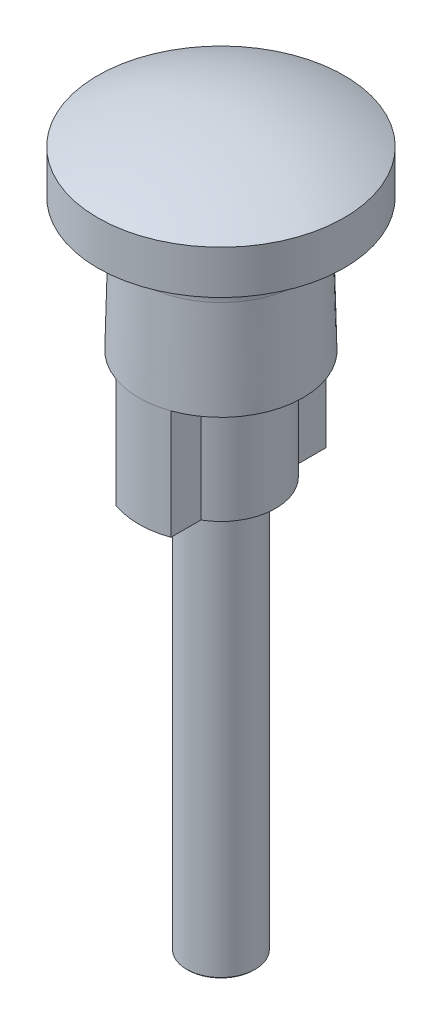
ISO-10303-21;
HEADER;
FILE_DESCRIPTION(('STEP AP214'),'2;1');
FILE_NAME('part.step','',(''),(''),'','','');
FILE_SCHEMA(('AUTOMOTIVE_DESIGN { 1 0 10303 214 1 1 1 1 }'));
ENDSEC;
DATA;
#1=APPLICATION_CONTEXT('core data for automotive mechanical design processes');
#2=APPLICATION_PROTOCOL_DEFINITION('international standard','automotive_design',2000,#1);
#3=PRODUCT_CONTEXT('',#1,'mechanical');
#4=PRODUCT('Part','Part','',(#3));
#5=PRODUCT_RELATED_PRODUCT_CATEGORY('part','',(#4));
#6=PRODUCT_DEFINITION_FORMATION('','',#4);
#7=PRODUCT_DEFINITION_CONTEXT('part definition',#1,'design');
#8=PRODUCT_DEFINITION('design','',#6,#7);
#9=PRODUCT_DEFINITION_SHAPE('','',#8);
#10=(LENGTH_UNIT() NAMED_UNIT(*) SI_UNIT(.MILLI.,.METRE.));
#11=(NAMED_UNIT(*) PLANE_ANGLE_UNIT() SI_UNIT($,.RADIAN.));
#12=(NAMED_UNIT(*) SI_UNIT($,.STERADIAN.) SOLID_ANGLE_UNIT());
#13=UNCERTAINTY_MEASURE_WITH_UNIT(LENGTH_MEASURE(1.E-05),#10,'distance_accuracy_value','');
#14=(GEOMETRIC_REPRESENTATION_CONTEXT(3) GLOBAL_UNCERTAINTY_ASSIGNED_CONTEXT((#13)) GLOBAL_UNIT_ASSIGNED_CONTEXT((#10,
#11,#12)) REPRESENTATION_CONTEXT('',''));
#15=CARTESIAN_POINT('',(0.,0.,0.));
#16=DIRECTION('',(0.,0.,1.));
#17=DIRECTION('',(1.,0.,0.));
#18=AXIS2_PLACEMENT_3D('',#15,#16,#17);
#19=CARTESIAN_POINT('',(0.,24.8362264150944,0.));
#20=DIRECTION('',(1.,0.,0.));
#21=DIRECTION('',(0.,0.,1.));
#22=AXIS2_PLACEMENT_3D('',#19,#20,#21);
#23=SPHERICAL_SURFACE('',#22,20.1637735849056);
#24=CARTESIAN_POINT('',(0.,42.88,0.));
#25=DIRECTION('',(0.,1.,0.));
#26=DIRECTION('',(0.,0.,1.));
#27=AXIS2_PLACEMENT_3D('',#24,#25,#26);
#28=CIRCLE('',#27,9.);
#29=CARTESIAN_POINT('',(0.,42.88,9.));
#30=VERTEX_POINT('',#29);
#31=EDGE_CURVE('E204',#30,#30,#28,.F.);
#32=ORIENTED_EDGE('',*,*,#31,.F.);
#33=EDGE_LOOP('',(#32));
#34=FACE_BOUND('',#33,.T.);
#35=ADVANCED_FACE('F16',(#34),#23,.T.);
#36=CARTESIAN_POINT('',(0.,-8.,0.));
#37=DIRECTION('',(0.,1.,0.));
#38=DIRECTION('',(0.,0.,1.));
#39=AXIS2_PLACEMENT_3D('',#36,#37,#38);
#40=CYLINDRICAL_SURFACE('',#39,9.);
#41=ORIENTED_EDGE('',*,*,#31,.T.);
#42=EDGE_LOOP('',(#41));
#43=FACE_BOUND('',#42,.T.);
#44=CARTESIAN_POINT('',(0.,39.7,0.));
#45=DIRECTION('',(0.,1.,0.));
#46=DIRECTION('',(0.,0.,1.));
#47=AXIS2_PLACEMENT_3D('',#44,#45,#46);
#48=CIRCLE('',#47,9.);
#49=CARTESIAN_POINT('',(0.,39.7,9.));
#50=VERTEX_POINT('',#49);
#51=EDGE_CURVE('E199',#50,#50,#48,.T.);
#52=ORIENTED_EDGE('',*,*,#51,.T.);
#53=EDGE_LOOP('',(#52));
#54=FACE_BOUND('',#53,.T.);
#55=ADVANCED_FACE('F234',(#43,#54),#40,.T.);
#56=CARTESIAN_POINT('',(9.,39.7,0.));
#57=DIRECTION('',(0.,1.,0.));
#58=DIRECTION('',(0.,0.,1.));
#59=AXIS2_PLACEMENT_3D('',#56,#57,#58);
#60=PLANE('',#59);
#61=CARTESIAN_POINT('',(0.,39.7,0.));
#62=DIRECTION('',(0.,-1.,0.));
#63=DIRECTION('',(0.,0.,-1.));
#64=AXIS2_PLACEMENT_3D('',#61,#62,#63);
#65=CIRCLE('',#64,8.32478228857056);
#66=CARTESIAN_POINT('',(0.,39.7,8.32478228857056));
#67=VERTEX_POINT('',#66);
#68=CARTESIAN_POINT('',(0.,39.7,-8.32478228857056));
#69=VERTEX_POINT('',#68);
#70=EDGE_CURVE('E203',#67,#69,#65,.F.);
#71=ORIENTED_EDGE('',*,*,#70,.T.);
#72=CARTESIAN_POINT('',(0.,39.7,0.));
#73=DIRECTION('',(0.,-1.,0.));
#74=DIRECTION('',(0.,0.,1.));
#75=AXIS2_PLACEMENT_3D('',#72,#73,#74);
#76=CIRCLE('',#75,8.32478228857056);
#77=EDGE_CURVE('E109',#69,#67,#76,.F.);
#78=ORIENTED_EDGE('',*,*,#77,.T.);
#79=EDGE_LOOP('',(#71,#78));
#80=FACE_BOUND('',#79,.T.);
#81=ORIENTED_EDGE('',*,*,#51,.F.);
#82=EDGE_LOOP('',(#81));
#83=FACE_BOUND('',#82,.T.);
#84=ADVANCED_FACE('F154',(#80,#83),#60,.F.);
#85=CARTESIAN_POINT('',(0.,37.2,0.));
#86=DIRECTION('',(0.,-1.,0.));
#87=DIRECTION('',(0.,0.,-1.));
#88=AXIS2_PLACEMENT_3D('',#85,#86,#87);
#89=TOROIDAL_SURFACE('',#88,8.32478228857056,2.5);
#90=ORIENTED_EDGE('',*,*,#77,.F.);
#91=ORIENTED_EDGE('',*,*,#70,.F.);
#92=EDGE_LOOP('',(#90,#91));
#93=FACE_BOUND('',#92,.T.);
#94=CARTESIAN_POINT('',(0.,37.138919554593,0.));
#95=DIRECTION('',(0.,-1.,0.));
#96=DIRECTION('',(0.,0.,-1.));
#97=AXIS2_PLACEMENT_3D('',#94,#95,#96);
#98=CIRCLE('',#97,5.82552856411844);
#99=CARTESIAN_POINT('',(0.,37.138919554593,-5.82552856411844));
#100=VERTEX_POINT('',#99);
#101=EDGE_CURVE('E108',#100,#100,#98,.T.);
#102=ORIENTED_EDGE('',*,*,#101,.F.);
#103=EDGE_LOOP('',(#102));
#104=FACE_BOUND('',#103,.T.);
#105=ADVANCED_FACE('F149',(#93,#104),#89,.F.);
#106=CARTESIAN_POINT('',(0.,30.,0.));
#107=DIRECTION('',(0.,1.,0.));
#108=DIRECTION('',(0.,0.,1.));
#109=AXIS2_PLACEMENT_3D('',#106,#107,#108);
#110=PLANE('',#109);
#111=CARTESIAN_POINT('',(0.,30.,0.));
#112=DIRECTION('',(0.,1.,0.));
#113=DIRECTION('',(0.,0.,1.));
#114=AXIS2_PLACEMENT_3D('',#111,#112,#113);
#115=CIRCLE('',#114,4.);
#116=CARTESIAN_POINT('',(-2.,30.,3.46410161513776));
#117=VERTEX_POINT('',#116);
#118=CARTESIAN_POINT('',(-2.,30.,-3.46410161513776));
#119=VERTEX_POINT('',#118);
#120=EDGE_CURVE('E119',#117,#119,#115,.F.);
#121=ORIENTED_EDGE('',*,*,#120,.F.);
#122=DIRECTION('',(0.,0.,1.));
#123=VECTOR('',#122,1.);
#124=CARTESIAN_POINT('',(-2.,30.,5.65685424949238));
#125=LINE('',#124,#123);
#126=CARTESIAN_POINT('',(-2.,29.9999999999864,5.65685424949283));
#127=VERTEX_POINT('',#126);
#128=EDGE_CURVE('E106',#127,#117,#125,.F.);
#129=ORIENTED_EDGE('',*,*,#128,.F.);
#130=CARTESIAN_POINT('',(0.,29.9999999999727,0.));
#131=DIRECTION('',(0.,-1.,0.));
#132=DIRECTION('',(0.,0.,-1.));
#133=AXIS2_PLACEMENT_3D('',#130,#131,#132);
#134=CIRCLE('',#133,6.00000000000084);
#135=CARTESIAN_POINT('',(-2.,29.9999999999864,-5.65685424949283));
#136=VERTEX_POINT('',#135);
#137=EDGE_CURVE('E88',#136,#127,#134,.F.);
#138=ORIENTED_EDGE('',*,*,#137,.F.);
#139=DIRECTION('',(0.,0.,1.));
#140=VECTOR('',#139,1.);
#141=CARTESIAN_POINT('',(-2.,30.,-3.46410161513775));
#142=LINE('',#141,#140);
#143=EDGE_CURVE('E97',#119,#136,#142,.F.);
#144=ORIENTED_EDGE('',*,*,#143,.F.);
#145=EDGE_LOOP('',(#121,#129,#138,#144));
#146=FACE_BOUND('',#145,.T.);
#147=ADVANCED_FACE('F102',(#146),#110,.F.);
#148=CARTESIAN_POINT('',(0.,30.0000000001432,0.));
#149=DIRECTION('',(0.,-1.,0.));
#150=DIRECTION('',(0.,0.,-1.));
#151=AXIS2_PLACEMENT_3D('',#148,#149,#150);
#152=CONICAL_SURFACE('',#151,5.99999999999667,0.0244346095278823);
#153=ORIENTED_EDGE('',*,*,#101,.T.);
#154=EDGE_LOOP('',(#153));
#155=FACE_BOUND('',#154,.T.);
#156=CARTESIAN_POINT('',(0.,29.9999999999999,0.));
#157=DIRECTION('',(0.,1.,0.));
#158=DIRECTION('',(0.,0.,1.));
#159=AXIS2_PLACEMENT_3D('',#156,#157,#158);
#160=CIRCLE('',#159,6.);
#161=CARTESIAN_POINT('',(2.,29.9999999999864,5.65685424949283));
#162=VERTEX_POINT('',#161);
#163=EDGE_CURVE('E457',#162,#127,#160,.F.);
#164=ORIENTED_EDGE('',*,*,#163,.F.);
#165=CARTESIAN_POINT('',(0.,29.9999999999727,0.));
#166=DIRECTION('',(0.,-1.,0.));
#167=DIRECTION('',(0.,0.,-1.));
#168=AXIS2_PLACEMENT_3D('',#165,#166,#167);
#169=CIRCLE('',#168,6.00000000000084);
#170=CARTESIAN_POINT('',(2.,29.9999999999864,-5.65685424949283));
#171=VERTEX_POINT('',#170);
#172=EDGE_CURVE('E91',#162,#171,#169,.F.);
#173=ORIENTED_EDGE('',*,*,#172,.T.);
#174=CARTESIAN_POINT('',(0.,29.9999999999999,0.));
#175=DIRECTION('',(0.,1.,0.));
#176=DIRECTION('',(0.,0.,1.));
#177=AXIS2_PLACEMENT_3D('',#174,#175,#176);
#178=CIRCLE('',#177,6.);
#179=EDGE_CURVE('E85',#136,#171,#178,.F.);
#180=ORIENTED_EDGE('',*,*,#179,.F.);
#181=ORIENTED_EDGE('',*,*,#137,.T.);
#182=EDGE_LOOP('',(#164,#173,#180,#181));
#183=FACE_BOUND('',#182,.T.);
#184=ADVANCED_FACE('F87',(#155,#183),#152,.T.);
#185=CARTESIAN_POINT('',(0.,30.,0.));
#186=DIRECTION('',(0.,1.,0.));
#187=DIRECTION('',(0.,0.,1.));
#188=AXIS2_PLACEMENT_3D('',#185,#186,#187);
#189=PLANE('',#188);
#190=CARTESIAN_POINT('',(0.,30.,0.));
#191=DIRECTION('',(0.,1.,0.));
#192=DIRECTION('',(0.,0.,1.));
#193=AXIS2_PLACEMENT_3D('',#190,#191,#192);
#194=CIRCLE('',#193,4.);
#195=CARTESIAN_POINT('',(2.,30.,-3.46410161513775));
#196=VERTEX_POINT('',#195);
#197=CARTESIAN_POINT('',(2.,30.,3.46410161513775));
#198=VERTEX_POINT('',#197);
#199=EDGE_CURVE('E141',#196,#198,#194,.F.);
#200=ORIENTED_EDGE('',*,*,#199,.F.);
#201=DIRECTION('',(0.,0.,-1.));
#202=VECTOR('',#201,1.);
#203=CARTESIAN_POINT('',(2.,30.,-5.65685424949238));
#204=LINE('',#203,#202);
#205=EDGE_CURVE('E136',#171,#196,#204,.F.);
#206=ORIENTED_EDGE('',*,*,#205,.F.);
#207=ORIENTED_EDGE('',*,*,#172,.F.);
#208=DIRECTION('',(0.,0.,-1.));
#209=VECTOR('',#208,1.);
#210=CARTESIAN_POINT('',(2.,30.,3.46410161513775));
#211=LINE('',#210,#209);
#212=EDGE_CURVE('E441',#198,#162,#211,.F.);
#213=ORIENTED_EDGE('',*,*,#212,.F.);
#214=EDGE_LOOP('',(#200,#206,#207,#213));
#215=FACE_BOUND('',#214,.T.);
#216=ADVANCED_FACE('F288',(#215),#189,.F.);
#217=CARTESIAN_POINT('',(0.,30.,0.));
#218=DIRECTION('',(0.,1.,0.));
#219=DIRECTION('',(0.,0.,1.));
#220=AXIS2_PLACEMENT_3D('',#217,#218,#219);
#221=CYLINDRICAL_SURFACE('',#220,4.);
#222=DIRECTION('',(0.,1.,0.));
#223=VECTOR('',#222,1.);
#224=CARTESIAN_POINT('',(2.,30.,-3.46410161513775));
#225=LINE('',#224,#223);
#226=CARTESIAN_POINT('',(2.,22.,-3.46410161513775));
#227=VERTEX_POINT('',#226);
#228=EDGE_CURVE('E140',#196,#227,#225,.F.);
#229=ORIENTED_EDGE('',*,*,#228,.F.);
#230=ORIENTED_EDGE('',*,*,#199,.T.);
#231=DIRECTION('',(0.,1.,0.));
#232=VECTOR('',#231,1.);
#233=CARTESIAN_POINT('',(2.,30.,3.46410161513775));
#234=LINE('',#233,#232);
#235=CARTESIAN_POINT('',(2.,22.,3.46410161513775));
#236=VERTEX_POINT('',#235);
#237=EDGE_CURVE('E454',#236,#198,#234,.T.);
#238=ORIENTED_EDGE('',*,*,#237,.F.);
#239=CARTESIAN_POINT('',(0.,22.,0.));
#240=DIRECTION('',(0.,1.,0.));
#241=DIRECTION('',(0.,0.,1.));
#242=AXIS2_PLACEMENT_3D('',#239,#240,#241);
#243=CIRCLE('',#242,4.);
#244=EDGE_CURVE('E190',#236,#227,#243,.T.);
#245=ORIENTED_EDGE('',*,*,#244,.T.);
#246=EDGE_LOOP('',(#229,#230,#238,#245));
#247=FACE_BOUND('',#246,.T.);
#248=ADVANCED_FACE('F284',(#247),#221,.T.);
#249=CARTESIAN_POINT('',(2.,30.,-5.65685424949238));
#250=DIRECTION('',(1.,0.,0.));
#251=DIRECTION('',(0.,0.,-1.));
#252=AXIS2_PLACEMENT_3D('',#249,#250,#251);
#253=PLANE('',#252);
#254=ORIENTED_EDGE('',*,*,#205,.T.);
#255=ORIENTED_EDGE('',*,*,#228,.T.);
#256=DIRECTION('',(0.,0.,1.));
#257=VECTOR('',#256,1.);
#258=CARTESIAN_POINT('',(2.,22.,0.));
#259=LINE('',#258,#257);
#260=CARTESIAN_POINT('',(2.,22.,-5.65685424949238));
#261=VERTEX_POINT('',#260);
#262=EDGE_CURVE('E189',#227,#261,#259,.F.);
#263=ORIENTED_EDGE('',*,*,#262,.T.);
#264=DIRECTION('',(0.,1.,0.));
#265=VECTOR('',#264,1.);
#266=CARTESIAN_POINT('',(2.,-8.,-5.65685424949238));
#267=LINE('',#266,#265);
#268=EDGE_CURVE('E98',#171,#261,#267,.F.);
#269=ORIENTED_EDGE('',*,*,#268,.F.);
#270=EDGE_LOOP('',(#254,#255,#263,#269));
#271=FACE_BOUND('',#270,.T.);
#272=ADVANCED_FACE('F281',(#271),#253,.T.);
#273=CARTESIAN_POINT('',(0.,-8.,0.));
#274=DIRECTION('',(0.,1.,0.));
#275=DIRECTION('',(0.,0.,1.));
#276=AXIS2_PLACEMENT_3D('',#273,#274,#275);
#277=CYLINDRICAL_SURFACE('',#276,6.);
#278=DIRECTION('',(0.,1.,0.));
#279=VECTOR('',#278,1.);
#280=CARTESIAN_POINT('',(-2.,30.,-5.65685424949238));
#281=LINE('',#280,#279);
#282=CARTESIAN_POINT('',(-2.,22.,-5.65685424949238));
#283=VERTEX_POINT('',#282);
#284=EDGE_CURVE('E112',#136,#283,#281,.F.);
#285=ORIENTED_EDGE('',*,*,#284,.F.);
#286=ORIENTED_EDGE('',*,*,#179,.T.);
#287=ORIENTED_EDGE('',*,*,#268,.T.);
#288=CARTESIAN_POINT('',(0.,22.,0.));
#289=DIRECTION('',(0.,1.,0.));
#290=DIRECTION('',(0.,0.,1.));
#291=AXIS2_PLACEMENT_3D('',#288,#289,#290);
#292=CIRCLE('',#291,6.);
#293=EDGE_CURVE('E115',#261,#283,#292,.T.);
#294=ORIENTED_EDGE('',*,*,#293,.T.);
#295=EDGE_LOOP('',(#285,#286,#287,#294));
#296=FACE_BOUND('',#295,.T.);
#297=ADVANCED_FACE('F113',(#296),#277,.T.);
#298=CARTESIAN_POINT('',(-2.,30.,-3.46410161513775));
#299=DIRECTION('',(-1.,0.,0.));
#300=DIRECTION('',(0.,0.,1.));
#301=AXIS2_PLACEMENT_3D('',#298,#299,#300);
#302=PLANE('',#301);
#303=ORIENTED_EDGE('',*,*,#143,.T.);
#304=ORIENTED_EDGE('',*,*,#284,.T.);
#305=DIRECTION('',(0.,0.,1.));
#306=VECTOR('',#305,1.);
#307=CARTESIAN_POINT('',(-2.,22.,0.));
#308=LINE('',#307,#306);
#309=CARTESIAN_POINT('',(-2.,22.,-3.46410161513776));
#310=VERTEX_POINT('',#309);
#311=EDGE_CURVE('E186',#283,#310,#308,.T.);
#312=ORIENTED_EDGE('',*,*,#311,.T.);
#313=DIRECTION('',(0.,1.,0.));
#314=VECTOR('',#313,1.);
#315=CARTESIAN_POINT('',(-2.,30.,-3.46410161513776));
#316=LINE('',#315,#314);
#317=EDGE_CURVE('E123',#119,#310,#316,.F.);
#318=ORIENTED_EDGE('',*,*,#317,.F.);
#319=EDGE_LOOP('',(#303,#304,#312,#318));
#320=FACE_BOUND('',#319,.T.);
#321=ADVANCED_FACE('F121',(#320),#302,.T.);
#322=CARTESIAN_POINT('',(0.,30.,0.));
#323=DIRECTION('',(0.,1.,0.));
#324=DIRECTION('',(0.,0.,1.));
#325=AXIS2_PLACEMENT_3D('',#322,#323,#324);
#326=CYLINDRICAL_SURFACE('',#325,4.);
#327=ORIENTED_EDGE('',*,*,#120,.T.);
#328=ORIENTED_EDGE('',*,*,#317,.T.);
#329=CARTESIAN_POINT('',(0.,22.,0.));
#330=DIRECTION('',(0.,1.,0.));
#331=DIRECTION('',(0.,0.,1.));
#332=AXIS2_PLACEMENT_3D('',#329,#330,#331);
#333=CIRCLE('',#332,4.);
#334=CARTESIAN_POINT('',(-2.,22.,3.46410161513776));
#335=VERTEX_POINT('',#334);
#336=EDGE_CURVE('E183',#310,#335,#333,.T.);
#337=ORIENTED_EDGE('',*,*,#336,.T.);
#338=DIRECTION('',(0.,1.,0.));
#339=VECTOR('',#338,1.);
#340=CARTESIAN_POINT('',(-2.,30.,3.46410161513776));
#341=LINE('',#340,#339);
#342=EDGE_CURVE('E456',#117,#335,#341,.F.);
#343=ORIENTED_EDGE('',*,*,#342,.F.);
#344=EDGE_LOOP('',(#327,#328,#337,#343));
#345=FACE_BOUND('',#344,.T.);
#346=ADVANCED_FACE('F272',(#345),#326,.T.);
#347=CARTESIAN_POINT('',(-2.,30.,5.65685424949238));
#348=DIRECTION('',(-1.,0.,0.));
#349=DIRECTION('',(0.,0.,1.));
#350=AXIS2_PLACEMENT_3D('',#347,#348,#349);
#351=PLANE('',#350);
#352=ORIENTED_EDGE('',*,*,#128,.T.);
#353=ORIENTED_EDGE('',*,*,#342,.T.);
#354=DIRECTION('',(0.,0.,1.));
#355=VECTOR('',#354,1.);
#356=CARTESIAN_POINT('',(-2.,22.,0.));
#357=LINE('',#356,#355);
#358=CARTESIAN_POINT('',(-2.,22.,5.65685424949238));
#359=VERTEX_POINT('',#358);
#360=EDGE_CURVE('E182',#335,#359,#357,.T.);
#361=ORIENTED_EDGE('',*,*,#360,.T.);
#362=DIRECTION('',(0.,1.,0.));
#363=VECTOR('',#362,1.);
#364=CARTESIAN_POINT('',(-2.,-8.,5.65685424949238));
#365=LINE('',#364,#363);
#366=EDGE_CURVE('E459',#127,#359,#365,.F.);
#367=ORIENTED_EDGE('',*,*,#366,.F.);
#368=EDGE_LOOP('',(#352,#353,#361,#367));
#369=FACE_BOUND('',#368,.T.);
#370=ADVANCED_FACE('F269',(#369),#351,.T.);
#371=CARTESIAN_POINT('',(0.,-8.,0.));
#372=DIRECTION('',(0.,1.,0.));
#373=DIRECTION('',(0.,0.,1.));
#374=AXIS2_PLACEMENT_3D('',#371,#372,#373);
#375=CYLINDRICAL_SURFACE('',#374,6.);
#376=ORIENTED_EDGE('',*,*,#366,.T.);
#377=CARTESIAN_POINT('',(0.,22.,0.));
#378=DIRECTION('',(0.,1.,0.));
#379=DIRECTION('',(0.,0.,1.));
#380=AXIS2_PLACEMENT_3D('',#377,#378,#379);
#381=CIRCLE('',#380,6.);
#382=CARTESIAN_POINT('',(2.,22.,5.65685424949238));
#383=VERTEX_POINT('',#382);
#384=EDGE_CURVE('E38',#359,#383,#381,.T.);
#385=ORIENTED_EDGE('',*,*,#384,.T.);
#386=DIRECTION('',(0.,1.,0.));
#387=VECTOR('',#386,1.);
#388=CARTESIAN_POINT('',(2.,30.,5.65685424949238));
#389=LINE('',#388,#387);
#390=EDGE_CURVE('E192',#162,#383,#389,.F.);
#391=ORIENTED_EDGE('',*,*,#390,.F.);
#392=ORIENTED_EDGE('',*,*,#163,.T.);
#393=EDGE_LOOP('',(#376,#385,#391,#392));
#394=FACE_BOUND('',#393,.T.);
#395=ADVANCED_FACE('F265',(#394),#375,.T.);
#396=CARTESIAN_POINT('',(2.,30.,3.46410161513775));
#397=DIRECTION('',(1.,0.,0.));
#398=DIRECTION('',(0.,0.,-1.));
#399=AXIS2_PLACEMENT_3D('',#396,#397,#398);
#400=PLANE('',#399);
#401=ORIENTED_EDGE('',*,*,#212,.T.);
#402=ORIENTED_EDGE('',*,*,#390,.T.);
#403=DIRECTION('',(0.,0.,1.));
#404=VECTOR('',#403,1.);
#405=CARTESIAN_POINT('',(2.,22.,0.));
#406=LINE('',#405,#404);
#407=EDGE_CURVE('E179',#383,#236,#406,.F.);
#408=ORIENTED_EDGE('',*,*,#407,.T.);
#409=ORIENTED_EDGE('',*,*,#237,.T.);
#410=EDGE_LOOP('',(#401,#402,#408,#409));
#411=FACE_BOUND('',#410,.T.);
#412=ADVANCED_FACE('F261',(#411),#400,.T.);
#413=CARTESIAN_POINT('',(2.4,-8.,0.));
#414=DIRECTION('',(0.,1.,0.));
#415=DIRECTION('',(0.,0.,1.));
#416=AXIS2_PLACEMENT_3D('',#413,#414,#415);
#417=PLANE('',#416);
#418=CARTESIAN_POINT('',(0.,-7.99999999998136,0.));
#419=DIRECTION('',(0.,1.,0.));
#420=DIRECTION('',(0.,0.,1.));
#421=AXIS2_PLACEMENT_3D('',#418,#419,#420);
#422=CIRCLE('',#421,2.40000000002283);
#423=CARTESIAN_POINT('',(0.,-7.99999999998136,2.40000000002283));
#424=VERTEX_POINT('',#423);
#425=EDGE_CURVE('E175',#424,#424,#422,.T.);
#426=ORIENTED_EDGE('',*,*,#425,.F.);
#427=EDGE_LOOP('',(#426));
#428=FACE_BOUND('',#427,.T.);
#429=ADVANCED_FACE('F257',(#428),#417,.F.);
#430=CARTESIAN_POINT('',(6.,22.,0.));
#431=DIRECTION('',(0.,1.,0.));
#432=DIRECTION('',(0.,0.,1.));
#433=AXIS2_PLACEMENT_3D('',#430,#431,#432);
#434=PLANE('',#433);
#435=CARTESIAN_POINT('',(0.,22.,0.));
#436=DIRECTION('',(0.,1.,0.));
#437=DIRECTION('',(0.,0.,1.));
#438=AXIS2_PLACEMENT_3D('',#435,#436,#437);
#439=CIRCLE('',#438,2.5);
#440=CARTESIAN_POINT('',(0.,22.,2.5));
#441=VERTEX_POINT('',#440);
#442=EDGE_CURVE('E29',#441,#441,#439,.F.);
#443=ORIENTED_EDGE('',*,*,#442,.F.);
#444=EDGE_LOOP('',(#443));
#445=FACE_BOUND('',#444,.T.);
#446=ORIENTED_EDGE('',*,*,#384,.F.);
#447=ORIENTED_EDGE('',*,*,#360,.F.);
#448=ORIENTED_EDGE('',*,*,#336,.F.);
#449=ORIENTED_EDGE('',*,*,#311,.F.);
#450=ORIENTED_EDGE('',*,*,#293,.F.);
#451=ORIENTED_EDGE('',*,*,#262,.F.);
#452=ORIENTED_EDGE('',*,*,#244,.F.);
#453=ORIENTED_EDGE('',*,*,#407,.F.);
#454=EDGE_LOOP('',(#446,#447,#448,#449,#450,#451,#452,#453));
#455=FACE_BOUND('',#454,.T.);
#456=ADVANCED_FACE('F250',(#445,#455),#434,.F.);
#457=CARTESIAN_POINT('',(0.,-7.90000000000646,0.));
#458=DIRECTION('',(0.,1.,0.));
#459=DIRECTION('',(0.,0.,1.));
#460=AXIS2_PLACEMENT_3D('',#457,#458,#459);
#461=CONICAL_SURFACE('',#460,2.49999999994088,0.785398163113231);
#462=ORIENTED_EDGE('',*,*,#425,.T.);
#463=EDGE_LOOP('',(#462));
#464=FACE_BOUND('',#463,.T.);
#465=CARTESIAN_POINT('',(0.,-7.9,0.));
#466=DIRECTION('',(0.,1.,0.));
#467=DIRECTION('',(0.,0.,1.));
#468=AXIS2_PLACEMENT_3D('',#465,#466,#467);
#469=CIRCLE('',#468,2.5);
#470=CARTESIAN_POINT('',(0.,-7.9,2.5));
#471=VERTEX_POINT('',#470);
#472=EDGE_CURVE('E11',#471,#471,#469,.T.);
#473=ORIENTED_EDGE('',*,*,#472,.F.);
#474=EDGE_LOOP('',(#473));
#475=FACE_BOUND('',#474,.T.);
#476=ADVANCED_FACE('F245',(#464,#475),#461,.T.);
#477=CARTESIAN_POINT('',(0.,-8.,0.));
#478=DIRECTION('',(0.,1.,0.));
#479=DIRECTION('',(0.,0.,1.));
#480=AXIS2_PLACEMENT_3D('',#477,#478,#479);
#481=CYLINDRICAL_SURFACE('',#480,2.5);
#482=ORIENTED_EDGE('',*,*,#472,.T.);
#483=EDGE_LOOP('',(#482));
#484=FACE_BOUND('',#483,.T.);
#485=ORIENTED_EDGE('',*,*,#442,.T.);
#486=EDGE_LOOP('',(#485));
#487=FACE_BOUND('',#486,.T.);
#488=ADVANCED_FACE('F243',(#484,#487),#481,.T.);
#489=CLOSED_SHELL('',(#35,#55,#84,#105,#147,#184,#216,#248,#272,#297,#321,#346,#370,#395,#412,
#429,#456,#476,#488));
#490=MANIFOLD_SOLID_BREP('B1',#489);
#491=ADVANCED_BREP_SHAPE_REPRESENTATION('',(#18,#490),#14);
#492=SHAPE_DEFINITION_REPRESENTATION(#9,#491);
ENDSEC;
END-ISO-10303-21;
